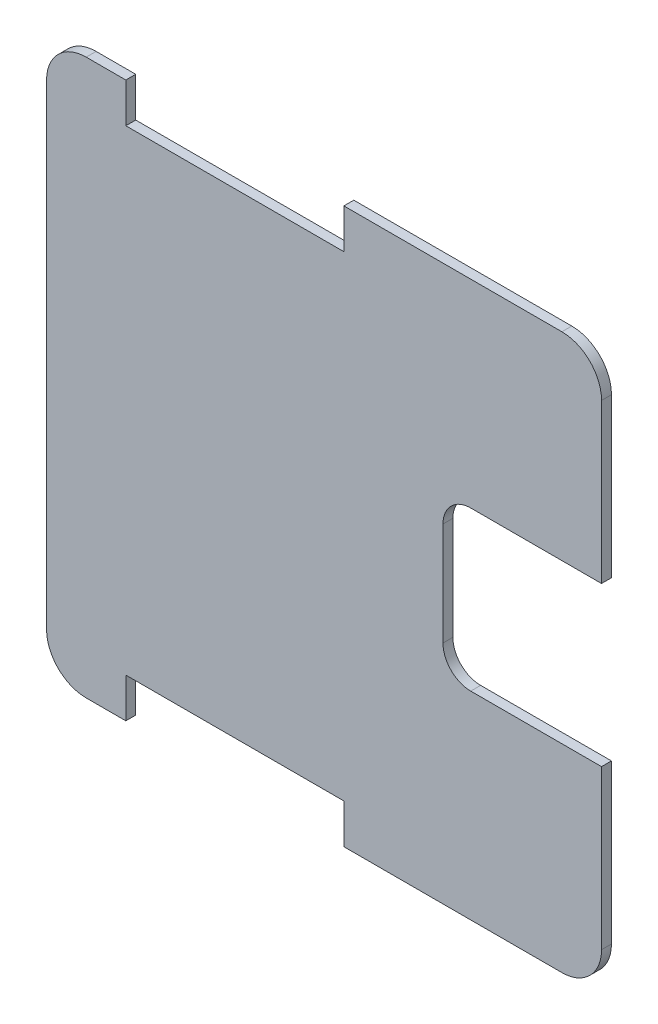
ISO-10303-21;
HEADER;
FILE_DESCRIPTION(('STEP AP214'),'2;1');
FILE_NAME('part.step','',(''),(''),'','','');
FILE_SCHEMA(('AUTOMOTIVE_DESIGN { 1 0 10303 214 1 1 1 1 }'));
ENDSEC;
DATA;
#1=APPLICATION_CONTEXT('core data for automotive mechanical design processes');
#2=APPLICATION_PROTOCOL_DEFINITION('international standard','automotive_design',2000,#1);
#3=PRODUCT_CONTEXT('',#1,'mechanical');
#4=PRODUCT('Part','Part','',(#3));
#5=PRODUCT_RELATED_PRODUCT_CATEGORY('part','',(#4));
#6=PRODUCT_DEFINITION_FORMATION('','',#4);
#7=PRODUCT_DEFINITION_CONTEXT('part definition',#1,'design');
#8=PRODUCT_DEFINITION('design','',#6,#7);
#9=PRODUCT_DEFINITION_SHAPE('','',#8);
#10=(LENGTH_UNIT() NAMED_UNIT(*) SI_UNIT(.MILLI.,.METRE.));
#11=(NAMED_UNIT(*) PLANE_ANGLE_UNIT() SI_UNIT($,.RADIAN.));
#12=(NAMED_UNIT(*) SI_UNIT($,.STERADIAN.) SOLID_ANGLE_UNIT());
#13=UNCERTAINTY_MEASURE_WITH_UNIT(LENGTH_MEASURE(1.E-05),#10,'distance_accuracy_value','');
#14=(GEOMETRIC_REPRESENTATION_CONTEXT(3) GLOBAL_UNCERTAINTY_ASSIGNED_CONTEXT((#13)) GLOBAL_UNIT_ASSIGNED_CONTEXT((#10,
#11,#12)) REPRESENTATION_CONTEXT('',''));
#15=CARTESIAN_POINT('',(0.,0.,0.));
#16=DIRECTION('',(0.,0.,1.));
#17=DIRECTION('',(1.,0.,0.));
#18=AXIS2_PLACEMENT_3D('',#15,#16,#17);
#19=CARTESIAN_POINT('',(355.6,25.4000000000002,6.35));
#20=DIRECTION('',(-1.,0.,0.));
#21=DIRECTION('',(0.,0.,1.));
#22=AXIS2_PLACEMENT_3D('',#19,#20,#21);
#23=PLANE('',#22);
#24=DIRECTION('',(0.,1.,0.));
#25=VECTOR('',#24,1.);
#26=CARTESIAN_POINT('',(355.6,25.4000000000002,6.35));
#27=LINE('',#26,#25);
#28=CARTESIAN_POINT('',(355.6,228.6,6.35));
#29=VERTEX_POINT('',#28);
#30=CARTESIAN_POINT('',(355.6,330.2,6.35));
#31=VERTEX_POINT('',#30);
#32=EDGE_CURVE('E208',#29,#31,#27,.T.);
#33=ORIENTED_EDGE('',*,*,#32,.F.);
#34=DIRECTION('',(0.,0.,-1.));
#35=VECTOR('',#34,1.);
#36=CARTESIAN_POINT('',(355.6,228.6,6.35));
#37=LINE('',#36,#35);
#38=CARTESIAN_POINT('',(355.6,228.6,0.));
#39=VERTEX_POINT('',#38);
#40=EDGE_CURVE('E290',#29,#39,#37,.T.);
#41=ORIENTED_EDGE('',*,*,#40,.T.);
#42=DIRECTION('',(0.,1.,0.));
#43=VECTOR('',#42,1.);
#44=CARTESIAN_POINT('',(355.6,25.4000000000002,0.));
#45=LINE('',#44,#43);
#46=CARTESIAN_POINT('',(355.6,330.2,0.));
#47=VERTEX_POINT('',#46);
#48=EDGE_CURVE('E233',#39,#47,#45,.T.);
#49=ORIENTED_EDGE('',*,*,#48,.T.);
#50=DIRECTION('',(0.,0.,-1.));
#51=VECTOR('',#50,1.);
#52=CARTESIAN_POINT('',(355.6,330.2,6.35));
#53=LINE('',#52,#51);
#54=EDGE_CURVE('E257',#31,#47,#53,.T.);
#55=ORIENTED_EDGE('',*,*,#54,.F.);
#56=EDGE_LOOP('',(#33,#41,#49,#55));
#57=FACE_BOUND('',#56,.T.);
#58=ADVANCED_FACE('F33',(#57),#23,.F.);
#59=CARTESIAN_POINT('',(25.4000000000002,0.,6.35));
#60=DIRECTION('',(0.,1.,0.));
#61=DIRECTION('',(0.,0.,1.));
#62=AXIS2_PLACEMENT_3D('',#59,#60,#61);
#63=PLANE('',#62);
#64=DIRECTION('',(1.,0.,0.));
#65=VECTOR('',#64,1.);
#66=CARTESIAN_POINT('',(25.4000000000002,0.,6.35));
#67=LINE('',#66,#65);
#68=CARTESIAN_POINT('',(190.5,0.,6.35));
#69=VERTEX_POINT('',#68);
#70=CARTESIAN_POINT('',(330.2,0.,6.35));
#71=VERTEX_POINT('',#70);
#72=EDGE_CURVE('E350',#69,#71,#67,.T.);
#73=ORIENTED_EDGE('',*,*,#72,.F.);
#74=DIRECTION('',(0.,0.,-1.));
#75=VECTOR('',#74,1.);
#76=CARTESIAN_POINT('',(190.5,0.,6.35));
#77=LINE('',#76,#75);
#78=CARTESIAN_POINT('',(190.5,0.,0.));
#79=VERTEX_POINT('',#78);
#80=EDGE_CURVE('E311',#69,#79,#77,.T.);
#81=ORIENTED_EDGE('',*,*,#80,.T.);
#82=DIRECTION('',(1.,0.,0.));
#83=VECTOR('',#82,1.);
#84=CARTESIAN_POINT('',(25.4000000000002,0.,0.));
#85=LINE('',#84,#83);
#86=CARTESIAN_POINT('',(330.2,0.,0.));
#87=VERTEX_POINT('',#86);
#88=EDGE_CURVE('E226',#79,#87,#85,.T.);
#89=ORIENTED_EDGE('',*,*,#88,.T.);
#90=DIRECTION('',(0.,0.,-1.));
#91=VECTOR('',#90,1.);
#92=CARTESIAN_POINT('',(330.2,0.,6.35));
#93=LINE('',#92,#91);
#94=EDGE_CURVE('E41',#71,#87,#93,.T.);
#95=ORIENTED_EDGE('',*,*,#94,.F.);
#96=EDGE_LOOP('',(#73,#81,#89,#95));
#97=FACE_BOUND('',#96,.T.);
#98=ADVANCED_FACE('F354',(#97),#63,.F.);
#99=CARTESIAN_POINT('',(25.4000000000002,355.6,6.35));
#100=DIRECTION('',(0.,-1.,0.));
#101=DIRECTION('',(0.,0.,-1.));
#102=AXIS2_PLACEMENT_3D('',#99,#100,#101);
#103=PLANE('',#102);
#104=DIRECTION('',(-1.,0.,0.));
#105=VECTOR('',#104,1.);
#106=CARTESIAN_POINT('',(25.4000000000002,355.6,0.));
#107=LINE('',#106,#105);
#108=CARTESIAN_POINT('',(330.2,355.6,0.));
#109=VERTEX_POINT('',#108);
#110=CARTESIAN_POINT('',(190.5,355.6,0.));
#111=VERTEX_POINT('',#110);
#112=EDGE_CURVE('E238',#109,#111,#107,.T.);
#113=ORIENTED_EDGE('',*,*,#112,.T.);
#114=DIRECTION('',(0.,0.,-1.));
#115=VECTOR('',#114,1.);
#116=CARTESIAN_POINT('',(190.5,355.6,6.35));
#117=LINE('',#116,#115);
#118=CARTESIAN_POINT('',(190.5,355.6,6.35));
#119=VERTEX_POINT('',#118);
#120=EDGE_CURVE('E227',#119,#111,#117,.T.);
#121=ORIENTED_EDGE('',*,*,#120,.F.);
#122=DIRECTION('',(-1.,0.,0.));
#123=VECTOR('',#122,1.);
#124=CARTESIAN_POINT('',(25.4000000000002,355.6,6.35));
#125=LINE('',#124,#123);
#126=CARTESIAN_POINT('',(330.2,355.6,6.35));
#127=VERTEX_POINT('',#126);
#128=EDGE_CURVE('E215',#127,#119,#125,.T.);
#129=ORIENTED_EDGE('',*,*,#128,.F.);
#130=DIRECTION('',(0.,0.,-1.));
#131=VECTOR('',#130,1.);
#132=CARTESIAN_POINT('',(330.2,355.6,6.35));
#133=LINE('',#132,#131);
#134=EDGE_CURVE('E254',#127,#109,#133,.T.);
#135=ORIENTED_EDGE('',*,*,#134,.T.);
#136=EDGE_LOOP('',(#113,#121,#129,#135));
#137=FACE_BOUND('',#136,.T.);
#138=ADVANCED_FACE('F380',(#137),#103,.F.);
#139=CARTESIAN_POINT('',(25.4,25.4,6.35));
#140=DIRECTION('',(0.,0.,-1.));
#141=DIRECTION('',(-1.,0.,0.));
#142=AXIS2_PLACEMENT_3D('',#139,#140,#141);
#143=CYLINDRICAL_SURFACE('',#142,25.4);
#144=CARTESIAN_POINT('',(25.4,25.4,0.));
#145=DIRECTION('',(0.,0.,1.));
#146=DIRECTION('',(-1.,0.,0.));
#147=AXIS2_PLACEMENT_3D('',#144,#145,#146);
#148=CIRCLE('',#147,25.4);
#149=CARTESIAN_POINT('',(0.,25.4000000000002,0.));
#150=VERTEX_POINT('',#149);
#151=CARTESIAN_POINT('',(25.4000000000002,0.,0.));
#152=VERTEX_POINT('',#151);
#153=EDGE_CURVE('E223',#150,#152,#148,.T.);
#154=ORIENTED_EDGE('',*,*,#153,.T.);
#155=DIRECTION('',(0.,0.,-1.));
#156=VECTOR('',#155,1.);
#157=CARTESIAN_POINT('',(25.4000000000002,0.,6.35));
#158=LINE('',#157,#156);
#159=CARTESIAN_POINT('',(25.4000000000002,0.,6.35));
#160=VERTEX_POINT('',#159);
#161=EDGE_CURVE('E11',#160,#152,#158,.T.);
#162=ORIENTED_EDGE('',*,*,#161,.F.);
#163=CARTESIAN_POINT('',(25.4,25.4,6.35));
#164=DIRECTION('',(0.,0.,1.));
#165=DIRECTION('',(-1.,0.,0.));
#166=AXIS2_PLACEMENT_3D('',#163,#164,#165);
#167=CIRCLE('',#166,25.4);
#168=CARTESIAN_POINT('',(0.,25.4000000000002,6.35));
#169=VERTEX_POINT('',#168);
#170=EDGE_CURVE('E245',#169,#160,#167,.T.);
#171=ORIENTED_EDGE('',*,*,#170,.F.);
#172=DIRECTION('',(0.,0.,-1.));
#173=VECTOR('',#172,1.);
#174=CARTESIAN_POINT('',(0.,25.4000000000002,6.35));
#175=LINE('',#174,#173);
#176=EDGE_CURVE('E222',#169,#150,#175,.T.);
#177=ORIENTED_EDGE('',*,*,#176,.T.);
#178=EDGE_LOOP('',(#154,#162,#171,#177));
#179=FACE_BOUND('',#178,.T.);
#180=ADVANCED_FACE('F35',(#179),#143,.T.);
#181=CARTESIAN_POINT('',(50.8,0.,0.));
#182=VERTEX_POINT('',#181);
#183=EDGE_CURVE('E228',#152,#182,#85,.T.);
#184=ORIENTED_EDGE('',*,*,#183,.T.);
#185=DIRECTION('',(0.,0.,-1.));
#186=VECTOR('',#185,1.);
#187=CARTESIAN_POINT('',(50.8,0.,6.35));
#188=LINE('',#187,#186);
#189=CARTESIAN_POINT('',(50.8,0.,6.35));
#190=VERTEX_POINT('',#189);
#191=EDGE_CURVE('E56',#190,#182,#188,.T.);
#192=ORIENTED_EDGE('',*,*,#191,.F.);
#193=EDGE_CURVE('E351',#160,#190,#67,.T.);
#194=ORIENTED_EDGE('',*,*,#193,.F.);
#195=ORIENTED_EDGE('',*,*,#161,.T.);
#196=EDGE_LOOP('',(#184,#192,#194,#195));
#197=FACE_BOUND('',#196,.T.);
#198=ADVANCED_FACE('F381',(#197),#63,.F.);
#199=CARTESIAN_POINT('',(330.2,25.4,6.35));
#200=DIRECTION('',(0.,0.,-1.));
#201=DIRECTION('',(-1.,0.,0.));
#202=AXIS2_PLACEMENT_3D('',#199,#200,#201);
#203=CYLINDRICAL_SURFACE('',#202,25.4);
#204=CARTESIAN_POINT('',(330.2,25.4,0.));
#205=DIRECTION('',(0.,0.,1.));
#206=DIRECTION('',(1.,0.,0.));
#207=AXIS2_PLACEMENT_3D('',#204,#205,#206);
#208=CIRCLE('',#207,25.4);
#209=CARTESIAN_POINT('',(355.6,25.4000000000002,0.));
#210=VERTEX_POINT('',#209);
#211=EDGE_CURVE('E231',#87,#210,#208,.T.);
#212=ORIENTED_EDGE('',*,*,#211,.T.);
#213=DIRECTION('',(0.,0.,-1.));
#214=VECTOR('',#213,1.);
#215=CARTESIAN_POINT('',(355.6,25.4000000000002,6.35));
#216=LINE('',#215,#214);
#217=CARTESIAN_POINT('',(355.6,25.4000000000002,6.35));
#218=VERTEX_POINT('',#217);
#219=EDGE_CURVE('E260',#218,#210,#216,.T.);
#220=ORIENTED_EDGE('',*,*,#219,.F.);
#221=CARTESIAN_POINT('',(330.2,25.4,6.35));
#222=DIRECTION('',(0.,0.,1.));
#223=DIRECTION('',(1.,0.,0.));
#224=AXIS2_PLACEMENT_3D('',#221,#222,#223);
#225=CIRCLE('',#224,25.4);
#226=EDGE_CURVE('E205',#71,#218,#225,.T.);
#227=ORIENTED_EDGE('',*,*,#226,.F.);
#228=ORIENTED_EDGE('',*,*,#94,.T.);
#229=EDGE_LOOP('',(#212,#220,#227,#228));
#230=FACE_BOUND('',#229,.T.);
#231=ADVANCED_FACE('F265',(#230),#203,.T.);
#232=CARTESIAN_POINT('',(355.6,127.,0.));
#233=VERTEX_POINT('',#232);
#234=EDGE_CURVE('E199',#210,#233,#45,.T.);
#235=ORIENTED_EDGE('',*,*,#234,.T.);
#236=DIRECTION('',(0.,0.,-1.));
#237=VECTOR('',#236,1.);
#238=CARTESIAN_POINT('',(355.6,127.,6.35));
#239=LINE('',#238,#237);
#240=CARTESIAN_POINT('',(355.6,127.,6.35));
#241=VERTEX_POINT('',#240);
#242=EDGE_CURVE('E48',#241,#233,#239,.T.);
#243=ORIENTED_EDGE('',*,*,#242,.F.);
#244=EDGE_CURVE('E197',#218,#241,#27,.T.);
#245=ORIENTED_EDGE('',*,*,#244,.F.);
#246=ORIENTED_EDGE('',*,*,#219,.T.);
#247=EDGE_LOOP('',(#235,#243,#245,#246));
#248=FACE_BOUND('',#247,.T.);
#249=ADVANCED_FACE('F195',(#248),#23,.F.);
#250=CARTESIAN_POINT('',(330.2,330.2,6.35));
#251=DIRECTION('',(0.,0.,-1.));
#252=DIRECTION('',(-1.,0.,0.));
#253=AXIS2_PLACEMENT_3D('',#250,#251,#252);
#254=CYLINDRICAL_SURFACE('',#253,25.4);
#255=CARTESIAN_POINT('',(330.2,330.2,0.));
#256=DIRECTION('',(0.,0.,1.));
#257=DIRECTION('',(-1.,0.,0.));
#258=AXIS2_PLACEMENT_3D('',#255,#256,#257);
#259=CIRCLE('',#258,25.4);
#260=EDGE_CURVE('E235',#47,#109,#259,.T.);
#261=ORIENTED_EDGE('',*,*,#260,.T.);
#262=ORIENTED_EDGE('',*,*,#134,.F.);
#263=CARTESIAN_POINT('',(330.2,330.2,6.35));
#264=DIRECTION('',(0.,0.,1.));
#265=DIRECTION('',(-1.,0.,0.));
#266=AXIS2_PLACEMENT_3D('',#263,#264,#265);
#267=CIRCLE('',#266,25.4);
#268=EDGE_CURVE('E207',#31,#127,#267,.T.);
#269=ORIENTED_EDGE('',*,*,#268,.F.);
#270=ORIENTED_EDGE('',*,*,#54,.T.);
#271=EDGE_LOOP('',(#261,#262,#269,#270));
#272=FACE_BOUND('',#271,.T.);
#273=ADVANCED_FACE('F386',(#272),#254,.T.);
#274=CARTESIAN_POINT('',(50.8,355.6,6.35));
#275=VERTEX_POINT('',#274);
#276=CARTESIAN_POINT('',(25.4000000000002,355.6,6.35));
#277=VERTEX_POINT('',#276);
#278=EDGE_CURVE('E210',#275,#277,#125,.T.);
#279=ORIENTED_EDGE('',*,*,#278,.F.);
#280=DIRECTION('',(0.,0.,-1.));
#281=VECTOR('',#280,1.);
#282=CARTESIAN_POINT('',(50.8,355.6,6.35));
#283=LINE('',#282,#281);
#284=CARTESIAN_POINT('',(50.8,355.6,0.));
#285=VERTEX_POINT('',#284);
#286=EDGE_CURVE('E342',#275,#285,#283,.T.);
#287=ORIENTED_EDGE('',*,*,#286,.T.);
#288=CARTESIAN_POINT('',(25.4000000000002,355.6,0.));
#289=VERTEX_POINT('',#288);
#290=EDGE_CURVE('E237',#285,#289,#107,.T.);
#291=ORIENTED_EDGE('',*,*,#290,.T.);
#292=DIRECTION('',(0.,0.,-1.));
#293=VECTOR('',#292,1.);
#294=CARTESIAN_POINT('',(25.4000000000002,355.6,6.35));
#295=LINE('',#294,#293);
#296=EDGE_CURVE('E251',#277,#289,#295,.T.);
#297=ORIENTED_EDGE('',*,*,#296,.F.);
#298=EDGE_LOOP('',(#279,#287,#291,#297));
#299=FACE_BOUND('',#298,.T.);
#300=ADVANCED_FACE('F391',(#299),#103,.F.);
#301=CARTESIAN_POINT('',(25.4,330.2,6.35));
#302=DIRECTION('',(0.,0.,-1.));
#303=DIRECTION('',(-1.,0.,0.));
#304=AXIS2_PLACEMENT_3D('',#301,#302,#303);
#305=CYLINDRICAL_SURFACE('',#304,25.4);
#306=CARTESIAN_POINT('',(25.4,330.2,0.));
#307=DIRECTION('',(0.,0.,1.));
#308=DIRECTION('',(-1.,0.,0.));
#309=AXIS2_PLACEMENT_3D('',#306,#307,#308);
#310=CIRCLE('',#309,25.4);
#311=CARTESIAN_POINT('',(0.,330.2,0.));
#312=VERTEX_POINT('',#311);
#313=EDGE_CURVE('E241',#289,#312,#310,.T.);
#314=ORIENTED_EDGE('',*,*,#313,.T.);
#315=DIRECTION('',(0.,0.,-1.));
#316=VECTOR('',#315,1.);
#317=CARTESIAN_POINT('',(0.,330.2,6.35));
#318=LINE('',#317,#316);
#319=CARTESIAN_POINT('',(0.,330.2,6.35));
#320=VERTEX_POINT('',#319);
#321=EDGE_CURVE('E248',#320,#312,#318,.T.);
#322=ORIENTED_EDGE('',*,*,#321,.F.);
#323=CARTESIAN_POINT('',(25.4,330.2,6.35));
#324=DIRECTION('',(0.,0.,1.));
#325=DIRECTION('',(-1.,0.,0.));
#326=AXIS2_PLACEMENT_3D('',#323,#324,#325);
#327=CIRCLE('',#326,25.4);
#328=EDGE_CURVE('E218',#277,#320,#327,.T.);
#329=ORIENTED_EDGE('',*,*,#328,.F.);
#330=ORIENTED_EDGE('',*,*,#296,.T.);
#331=EDGE_LOOP('',(#314,#322,#329,#330));
#332=FACE_BOUND('',#331,.T.);
#333=ADVANCED_FACE('F413',(#332),#305,.T.);
#334=CARTESIAN_POINT('',(0.,25.4000000000002,6.35));
#335=DIRECTION('',(1.,0.,0.));
#336=DIRECTION('',(0.,0.,-1.));
#337=AXIS2_PLACEMENT_3D('',#334,#335,#336);
#338=PLANE('',#337);
#339=DIRECTION('',(0.,-1.,0.));
#340=VECTOR('',#339,1.);
#341=CARTESIAN_POINT('',(0.,25.4000000000002,0.));
#342=LINE('',#341,#340);
#343=EDGE_CURVE('E243',#312,#150,#342,.T.);
#344=ORIENTED_EDGE('',*,*,#343,.T.);
#345=ORIENTED_EDGE('',*,*,#176,.F.);
#346=DIRECTION('',(0.,-1.,0.));
#347=VECTOR('',#346,1.);
#348=CARTESIAN_POINT('',(0.,25.4000000000002,6.35));
#349=LINE('',#348,#347);
#350=EDGE_CURVE('E220',#320,#169,#349,.T.);
#351=ORIENTED_EDGE('',*,*,#350,.F.);
#352=ORIENTED_EDGE('',*,*,#321,.T.);
#353=EDGE_LOOP('',(#344,#345,#351,#352));
#354=FACE_BOUND('',#353,.T.);
#355=ADVANCED_FACE('F409',(#354),#338,.F.);
#356=CARTESIAN_POINT('',(25.4,25.4,6.35));
#357=DIRECTION('',(0.,0.,-1.));
#358=DIRECTION('',(-1.,0.,0.));
#359=AXIS2_PLACEMENT_3D('',#356,#357,#358);
#360=PLANE('',#359);
#361=CARTESIAN_POINT('',(271.78,210.82,6.35));
#362=DIRECTION('',(0.,0.,-1.));
#363=DIRECTION('',(1.,0.,0.));
#364=AXIS2_PLACEMENT_3D('',#361,#362,#363);
#365=CIRCLE('',#364,17.78);
#366=CARTESIAN_POINT('',(254.,210.82,6.35));
#367=VERTEX_POINT('',#366);
#368=CARTESIAN_POINT('',(271.78,228.6,6.35));
#369=VERTEX_POINT('',#368);
#370=EDGE_CURVE('E442',#367,#369,#365,.T.);
#371=ORIENTED_EDGE('',*,*,#370,.T.);
#372=DIRECTION('',(1.,0.,0.));
#373=VECTOR('',#372,1.);
#374=CARTESIAN_POINT('',(355.6,228.6,6.35));
#375=LINE('',#374,#373);
#376=EDGE_CURVE('E200',#369,#29,#375,.T.);
#377=ORIENTED_EDGE('',*,*,#376,.T.);
#378=ORIENTED_EDGE('',*,*,#32,.T.);
#379=ORIENTED_EDGE('',*,*,#268,.T.);
#380=ORIENTED_EDGE('',*,*,#128,.T.);
#381=DIRECTION('',(0.,-1.,0.));
#382=VECTOR('',#381,1.);
#383=CARTESIAN_POINT('',(190.5,355.6,6.35));
#384=LINE('',#383,#382);
#385=CARTESIAN_POINT('',(190.5,330.2,6.35));
#386=VERTEX_POINT('',#385);
#387=EDGE_CURVE('E325',#119,#386,#384,.T.);
#388=ORIENTED_EDGE('',*,*,#387,.T.);
#389=DIRECTION('',(-1.,0.,0.));
#390=VECTOR('',#389,1.);
#391=CARTESIAN_POINT('',(190.5,330.2,6.35));
#392=LINE('',#391,#390);
#393=CARTESIAN_POINT('',(50.8,330.2,6.35));
#394=VERTEX_POINT('',#393);
#395=EDGE_CURVE('E328',#386,#394,#392,.T.);
#396=ORIENTED_EDGE('',*,*,#395,.T.);
#397=DIRECTION('',(0.,1.,0.));
#398=VECTOR('',#397,1.);
#399=CARTESIAN_POINT('',(50.8,355.6,6.35));
#400=LINE('',#399,#398);
#401=EDGE_CURVE('E332',#394,#275,#400,.T.);
#402=ORIENTED_EDGE('',*,*,#401,.T.);
#403=ORIENTED_EDGE('',*,*,#278,.T.);
#404=ORIENTED_EDGE('',*,*,#328,.T.);
#405=ORIENTED_EDGE('',*,*,#350,.T.);
#406=ORIENTED_EDGE('',*,*,#170,.T.);
#407=ORIENTED_EDGE('',*,*,#193,.T.);
#408=DIRECTION('',(0.,1.,0.));
#409=VECTOR('',#408,1.);
#410=CARTESIAN_POINT('',(50.8,25.4,6.35));
#411=LINE('',#410,#409);
#412=CARTESIAN_POINT('',(50.8,25.4,6.35));
#413=VERTEX_POINT('',#412);
#414=EDGE_CURVE('E304',#190,#413,#411,.T.);
#415=ORIENTED_EDGE('',*,*,#414,.T.);
#416=DIRECTION('',(1.,0.,0.));
#417=VECTOR('',#416,1.);
#418=CARTESIAN_POINT('',(190.5,25.4,6.35));
#419=LINE('',#418,#417);
#420=CARTESIAN_POINT('',(190.5,25.4,6.35));
#421=VERTEX_POINT('',#420);
#422=EDGE_CURVE('E308',#413,#421,#419,.T.);
#423=ORIENTED_EDGE('',*,*,#422,.T.);
#424=DIRECTION('',(0.,-1.,0.));
#425=VECTOR('',#424,1.);
#426=CARTESIAN_POINT('',(190.5,25.4,6.35));
#427=LINE('',#426,#425);
#428=EDGE_CURVE('E301',#421,#69,#427,.T.);
#429=ORIENTED_EDGE('',*,*,#428,.T.);
#430=ORIENTED_EDGE('',*,*,#72,.T.);
#431=ORIENTED_EDGE('',*,*,#226,.T.);
#432=ORIENTED_EDGE('',*,*,#244,.T.);
#433=DIRECTION('',(-1.,0.,0.));
#434=VECTOR('',#433,1.);
#435=CARTESIAN_POINT('',(355.6,127.,6.35));
#436=LINE('',#435,#434);
#437=CARTESIAN_POINT('',(271.78,127.,6.35));
#438=VERTEX_POINT('',#437);
#439=EDGE_CURVE('E182',#241,#438,#436,.T.);
#440=ORIENTED_EDGE('',*,*,#439,.T.);
#441=CARTESIAN_POINT('',(271.78,144.78,6.35));
#442=DIRECTION('',(0.,0.,-1.));
#443=DIRECTION('',(-1.,0.,0.));
#444=AXIS2_PLACEMENT_3D('',#441,#442,#443);
#445=CIRCLE('',#444,17.78);
#446=CARTESIAN_POINT('',(254.,144.78,6.35));
#447=VERTEX_POINT('',#446);
#448=EDGE_CURVE('E189',#438,#447,#445,.T.);
#449=ORIENTED_EDGE('',*,*,#448,.T.);
#450=DIRECTION('',(0.,1.,0.));
#451=VECTOR('',#450,1.);
#452=CARTESIAN_POINT('',(254.,144.78,6.35));
#453=LINE('',#452,#451);
#454=EDGE_CURVE('E443',#447,#367,#453,.T.);
#455=ORIENTED_EDGE('',*,*,#454,.T.);
#456=EDGE_LOOP('',(#371,#377,#378,#379,#380,#388,#396,#402,#403,#404,#405,#406,#407,#415,#423,
#429,#430,#431,#432,#440,#449,#455));
#457=FACE_BOUND('',#456,.T.);
#458=ADVANCED_FACE('F203',(#457),#360,.F.);
#459=CARTESIAN_POINT('',(25.4,25.4,0.));
#460=DIRECTION('',(0.,0.,-1.));
#461=DIRECTION('',(-1.,0.,0.));
#462=AXIS2_PLACEMENT_3D('',#459,#460,#461);
#463=PLANE('',#462);
#464=DIRECTION('',(1.,0.,0.));
#465=VECTOR('',#464,1.);
#466=CARTESIAN_POINT('',(355.6,228.6,0.));
#467=LINE('',#466,#465);
#468=CARTESIAN_POINT('',(271.78,228.6,0.));
#469=VERTEX_POINT('',#468);
#470=EDGE_CURVE('E190',#469,#39,#467,.T.);
#471=ORIENTED_EDGE('',*,*,#470,.F.);
#472=CARTESIAN_POINT('',(271.78,210.82,0.));
#473=DIRECTION('',(0.,0.,-1.));
#474=DIRECTION('',(1.,0.,0.));
#475=AXIS2_PLACEMENT_3D('',#472,#473,#474);
#476=CIRCLE('',#475,17.78);
#477=CARTESIAN_POINT('',(254.,210.82,0.));
#478=VERTEX_POINT('',#477);
#479=EDGE_CURVE('E286',#478,#469,#476,.T.);
#480=ORIENTED_EDGE('',*,*,#479,.F.);
#481=DIRECTION('',(0.,1.,0.));
#482=VECTOR('',#481,1.);
#483=CARTESIAN_POINT('',(254.,144.78,0.));
#484=LINE('',#483,#482);
#485=CARTESIAN_POINT('',(254.,144.78,0.));
#486=VERTEX_POINT('',#485);
#487=EDGE_CURVE('E279',#486,#478,#484,.T.);
#488=ORIENTED_EDGE('',*,*,#487,.F.);
#489=CARTESIAN_POINT('',(271.78,144.78,0.));
#490=DIRECTION('',(0.,0.,-1.));
#491=DIRECTION('',(-1.,0.,0.));
#492=AXIS2_PLACEMENT_3D('',#489,#490,#491);
#493=CIRCLE('',#492,17.78);
#494=CARTESIAN_POINT('',(271.78,127.,0.));
#495=VERTEX_POINT('',#494);
#496=EDGE_CURVE('E277',#495,#486,#493,.T.);
#497=ORIENTED_EDGE('',*,*,#496,.F.);
#498=DIRECTION('',(-1.,0.,0.));
#499=VECTOR('',#498,1.);
#500=CARTESIAN_POINT('',(355.6,127.,0.));
#501=LINE('',#500,#499);
#502=EDGE_CURVE('E274',#233,#495,#501,.T.);
#503=ORIENTED_EDGE('',*,*,#502,.F.);
#504=ORIENTED_EDGE('',*,*,#234,.F.);
#505=ORIENTED_EDGE('',*,*,#211,.F.);
#506=ORIENTED_EDGE('',*,*,#88,.F.);
#507=DIRECTION('',(0.,-1.,0.));
#508=VECTOR('',#507,1.);
#509=CARTESIAN_POINT('',(190.5,25.4,0.));
#510=LINE('',#509,#508);
#511=CARTESIAN_POINT('',(190.5,25.4,0.));
#512=VERTEX_POINT('',#511);
#513=EDGE_CURVE('E293',#512,#79,#510,.T.);
#514=ORIENTED_EDGE('',*,*,#513,.F.);
#515=DIRECTION('',(1.,0.,0.));
#516=VECTOR('',#515,1.);
#517=CARTESIAN_POINT('',(190.5,25.4,0.));
#518=LINE('',#517,#516);
#519=CARTESIAN_POINT('',(50.8,25.4,0.));
#520=VERTEX_POINT('',#519);
#521=EDGE_CURVE('E305',#520,#512,#518,.T.);
#522=ORIENTED_EDGE('',*,*,#521,.F.);
#523=DIRECTION('',(0.,1.,0.));
#524=VECTOR('',#523,1.);
#525=CARTESIAN_POINT('',(50.8,25.4,0.));
#526=LINE('',#525,#524);
#527=EDGE_CURVE('E313',#182,#520,#526,.T.);
#528=ORIENTED_EDGE('',*,*,#527,.F.);
#529=ORIENTED_EDGE('',*,*,#183,.F.);
#530=ORIENTED_EDGE('',*,*,#153,.F.);
#531=ORIENTED_EDGE('',*,*,#343,.F.);
#532=ORIENTED_EDGE('',*,*,#313,.F.);
#533=ORIENTED_EDGE('',*,*,#290,.F.);
#534=DIRECTION('',(0.,1.,0.));
#535=VECTOR('',#534,1.);
#536=CARTESIAN_POINT('',(50.8,355.6,0.));
#537=LINE('',#536,#535);
#538=CARTESIAN_POINT('',(50.8,330.2,0.));
#539=VERTEX_POINT('',#538);
#540=EDGE_CURVE('E329',#539,#285,#537,.T.);
#541=ORIENTED_EDGE('',*,*,#540,.F.);
#542=DIRECTION('',(-1.,0.,0.));
#543=VECTOR('',#542,1.);
#544=CARTESIAN_POINT('',(190.5,330.2,0.));
#545=LINE('',#544,#543);
#546=CARTESIAN_POINT('',(190.5,330.2,0.));
#547=VERTEX_POINT('',#546);
#548=EDGE_CURVE('E337',#547,#539,#545,.T.);
#549=ORIENTED_EDGE('',*,*,#548,.F.);
#550=DIRECTION('',(0.,-1.,0.));
#551=VECTOR('',#550,1.);
#552=CARTESIAN_POINT('',(190.5,355.6,0.));
#553=LINE('',#552,#551);
#554=EDGE_CURVE('E319',#111,#547,#553,.T.);
#555=ORIENTED_EDGE('',*,*,#554,.F.);
#556=ORIENTED_EDGE('',*,*,#112,.F.);
#557=ORIENTED_EDGE('',*,*,#260,.F.);
#558=ORIENTED_EDGE('',*,*,#48,.F.);
#559=EDGE_LOOP('',(#471,#480,#488,#497,#503,#504,#505,#506,#514,#522,#528,#529,#530,#531,#532,
#533,#541,#549,#555,#556,#557,#558));
#560=FACE_BOUND('',#559,.T.);
#561=ADVANCED_FACE('F271',(#560),#463,.T.);
#562=CARTESIAN_POINT('',(190.5,355.6,6.35));
#563=DIRECTION('',(1.,0.,0.));
#564=DIRECTION('',(0.,0.,-1.));
#565=AXIS2_PLACEMENT_3D('',#562,#563,#564);
#566=PLANE('',#565);
#567=ORIENTED_EDGE('',*,*,#554,.T.);
#568=DIRECTION('',(0.,0.,-1.));
#569=VECTOR('',#568,1.);
#570=CARTESIAN_POINT('',(190.5,330.2,6.35));
#571=LINE('',#570,#569);
#572=EDGE_CURVE('E335',#386,#547,#571,.T.);
#573=ORIENTED_EDGE('',*,*,#572,.F.);
#574=ORIENTED_EDGE('',*,*,#387,.F.);
#575=ORIENTED_EDGE('',*,*,#120,.T.);
#576=EDGE_LOOP('',(#567,#573,#574,#575));
#577=FACE_BOUND('',#576,.T.);
#578=ADVANCED_FACE('F492',(#577),#566,.F.);
#579=CARTESIAN_POINT('',(50.8,355.6,6.35));
#580=DIRECTION('',(-1.,0.,0.));
#581=DIRECTION('',(0.,0.,1.));
#582=AXIS2_PLACEMENT_3D('',#579,#580,#581);
#583=PLANE('',#582);
#584=ORIENTED_EDGE('',*,*,#540,.T.);
#585=ORIENTED_EDGE('',*,*,#286,.F.);
#586=ORIENTED_EDGE('',*,*,#401,.F.);
#587=DIRECTION('',(0.,0.,-1.));
#588=VECTOR('',#587,1.);
#589=CARTESIAN_POINT('',(50.8,330.2,6.35));
#590=LINE('',#589,#588);
#591=EDGE_CURVE('E345',#394,#539,#590,.T.);
#592=ORIENTED_EDGE('',*,*,#591,.T.);
#593=EDGE_LOOP('',(#584,#585,#586,#592));
#594=FACE_BOUND('',#593,.T.);
#595=ADVANCED_FACE('F422',(#594),#583,.F.);
#596=CARTESIAN_POINT('',(190.5,330.2,6.35));
#597=DIRECTION('',(0.,-1.,0.));
#598=DIRECTION('',(0.,0.,-1.));
#599=AXIS2_PLACEMENT_3D('',#596,#597,#598);
#600=PLANE('',#599);
#601=ORIENTED_EDGE('',*,*,#548,.T.);
#602=ORIENTED_EDGE('',*,*,#591,.F.);
#603=ORIENTED_EDGE('',*,*,#395,.F.);
#604=ORIENTED_EDGE('',*,*,#572,.T.);
#605=EDGE_LOOP('',(#601,#602,#603,#604));
#606=FACE_BOUND('',#605,.T.);
#607=ADVANCED_FACE('F425',(#606),#600,.F.);
#608=CARTESIAN_POINT('',(190.5,25.4,6.35));
#609=DIRECTION('',(1.,0.,0.));
#610=DIRECTION('',(0.,0.,-1.));
#611=AXIS2_PLACEMENT_3D('',#608,#609,#610);
#612=PLANE('',#611);
#613=ORIENTED_EDGE('',*,*,#513,.T.);
#614=ORIENTED_EDGE('',*,*,#80,.F.);
#615=ORIENTED_EDGE('',*,*,#428,.F.);
#616=DIRECTION('',(0.,0.,-1.));
#617=VECTOR('',#616,1.);
#618=CARTESIAN_POINT('',(190.5,25.4,6.35));
#619=LINE('',#618,#617);
#620=EDGE_CURVE('E317',#421,#512,#619,.T.);
#621=ORIENTED_EDGE('',*,*,#620,.T.);
#622=EDGE_LOOP('',(#613,#614,#615,#621));
#623=FACE_BOUND('',#622,.T.);
#624=ADVANCED_FACE('F356',(#623),#612,.F.);
#625=CARTESIAN_POINT('',(190.5,25.4,6.35));
#626=DIRECTION('',(0.,1.,0.));
#627=DIRECTION('',(0.,0.,1.));
#628=AXIS2_PLACEMENT_3D('',#625,#626,#627);
#629=PLANE('',#628);
#630=ORIENTED_EDGE('',*,*,#521,.T.);
#631=ORIENTED_EDGE('',*,*,#620,.F.);
#632=ORIENTED_EDGE('',*,*,#422,.F.);
#633=DIRECTION('',(0.,0.,-1.));
#634=VECTOR('',#633,1.);
#635=CARTESIAN_POINT('',(50.8,25.4,6.35));
#636=LINE('',#635,#634);
#637=EDGE_CURVE('E320',#413,#520,#636,.T.);
#638=ORIENTED_EDGE('',*,*,#637,.T.);
#639=EDGE_LOOP('',(#630,#631,#632,#638));
#640=FACE_BOUND('',#639,.T.);
#641=ADVANCED_FACE('F359',(#640),#629,.F.);
#642=CARTESIAN_POINT('',(50.8,25.4,6.35));
#643=DIRECTION('',(-1.,0.,0.));
#644=DIRECTION('',(0.,-1.,0.));
#645=AXIS2_PLACEMENT_3D('',#642,#643,#644);
#646=PLANE('',#645);
#647=ORIENTED_EDGE('',*,*,#527,.T.);
#648=ORIENTED_EDGE('',*,*,#637,.F.);
#649=ORIENTED_EDGE('',*,*,#414,.F.);
#650=ORIENTED_EDGE('',*,*,#191,.T.);
#651=EDGE_LOOP('',(#647,#648,#649,#650));
#652=FACE_BOUND('',#651,.T.);
#653=ADVANCED_FACE('F361',(#652),#646,.F.);
#654=CARTESIAN_POINT('',(355.6,228.6,6.35));
#655=DIRECTION('',(0.,1.,0.));
#656=DIRECTION('',(0.,0.,1.));
#657=AXIS2_PLACEMENT_3D('',#654,#655,#656);
#658=PLANE('',#657);
#659=ORIENTED_EDGE('',*,*,#470,.T.);
#660=ORIENTED_EDGE('',*,*,#40,.F.);
#661=ORIENTED_EDGE('',*,*,#376,.F.);
#662=DIRECTION('',(0.,0.,-1.));
#663=VECTOR('',#662,1.);
#664=CARTESIAN_POINT('',(271.78,228.6,6.35));
#665=LINE('',#664,#663);
#666=EDGE_CURVE('E294',#369,#469,#665,.T.);
#667=ORIENTED_EDGE('',*,*,#666,.T.);
#668=EDGE_LOOP('',(#659,#660,#661,#667));
#669=FACE_BOUND('',#668,.T.);
#670=ADVANCED_FACE('F363',(#669),#658,.F.);
#671=CARTESIAN_POINT('',(271.78,210.82,6.35));
#672=DIRECTION('',(0.,0.,-1.));
#673=DIRECTION('',(-1.,0.,0.));
#674=AXIS2_PLACEMENT_3D('',#671,#672,#673);
#675=CYLINDRICAL_SURFACE('',#674,17.78);
#676=ORIENTED_EDGE('',*,*,#479,.T.);
#677=ORIENTED_EDGE('',*,*,#666,.F.);
#678=ORIENTED_EDGE('',*,*,#370,.F.);
#679=DIRECTION('',(0.,0.,-1.));
#680=VECTOR('',#679,1.);
#681=CARTESIAN_POINT('',(254.,210.82,6.35));
#682=LINE('',#681,#680);
#683=EDGE_CURVE('E296',#367,#478,#682,.T.);
#684=ORIENTED_EDGE('',*,*,#683,.T.);
#685=EDGE_LOOP('',(#676,#677,#678,#684));
#686=FACE_BOUND('',#685,.T.);
#687=ADVANCED_FACE('F369',(#686),#675,.F.);
#688=CARTESIAN_POINT('',(254.,144.78,6.35));
#689=DIRECTION('',(-1.,0.,0.));
#690=DIRECTION('',(0.,0.,1.));
#691=AXIS2_PLACEMENT_3D('',#688,#689,#690);
#692=PLANE('',#691);
#693=ORIENTED_EDGE('',*,*,#487,.T.);
#694=ORIENTED_EDGE('',*,*,#683,.F.);
#695=ORIENTED_EDGE('',*,*,#454,.F.);
#696=DIRECTION('',(0.,0.,-1.));
#697=VECTOR('',#696,1.);
#698=CARTESIAN_POINT('',(254.,144.78,6.35));
#699=LINE('',#698,#697);
#700=EDGE_CURVE('E298',#447,#486,#699,.T.);
#701=ORIENTED_EDGE('',*,*,#700,.T.);
#702=EDGE_LOOP('',(#693,#694,#695,#701));
#703=FACE_BOUND('',#702,.T.);
#704=ADVANCED_FACE('F450',(#703),#692,.F.);
#705=CARTESIAN_POINT('',(271.78,144.78,6.35));
#706=DIRECTION('',(0.,0.,-1.));
#707=DIRECTION('',(-1.,0.,0.));
#708=AXIS2_PLACEMENT_3D('',#705,#706,#707);
#709=CYLINDRICAL_SURFACE('',#708,17.78);
#710=ORIENTED_EDGE('',*,*,#496,.T.);
#711=ORIENTED_EDGE('',*,*,#700,.F.);
#712=ORIENTED_EDGE('',*,*,#448,.F.);
#713=DIRECTION('',(0.,0.,-1.));
#714=VECTOR('',#713,1.);
#715=CARTESIAN_POINT('',(271.78,127.,6.35));
#716=LINE('',#715,#714);
#717=EDGE_CURVE('E184',#438,#495,#716,.T.);
#718=ORIENTED_EDGE('',*,*,#717,.T.);
#719=EDGE_LOOP('',(#710,#711,#712,#718));
#720=FACE_BOUND('',#719,.T.);
#721=ADVANCED_FACE('F448',(#720),#709,.F.);
#722=CARTESIAN_POINT('',(355.6,127.,6.35));
#723=DIRECTION('',(0.,-1.,0.));
#724=DIRECTION('',(0.,0.,-1.));
#725=AXIS2_PLACEMENT_3D('',#722,#723,#724);
#726=PLANE('',#725);
#727=ORIENTED_EDGE('',*,*,#502,.T.);
#728=ORIENTED_EDGE('',*,*,#717,.F.);
#729=ORIENTED_EDGE('',*,*,#439,.F.);
#730=ORIENTED_EDGE('',*,*,#242,.T.);
#731=EDGE_LOOP('',(#727,#728,#729,#730));
#732=FACE_BOUND('',#731,.T.);
#733=ADVANCED_FACE('F183',(#732),#726,.F.);
#734=CLOSED_SHELL('',(#58,#98,#138,#180,#198,#231,#249,#273,#300,#333,#355,#458,#561,#578,#595,
#607,#624,#641,#653,#670,#687,#704,#721,#733));
#735=MANIFOLD_SOLID_BREP('B2',#734);
#736=ADVANCED_BREP_SHAPE_REPRESENTATION('',(#18,#735),#14);
#737=SHAPE_DEFINITION_REPRESENTATION(#9,#736);
ENDSEC;
END-ISO-10303-21;
